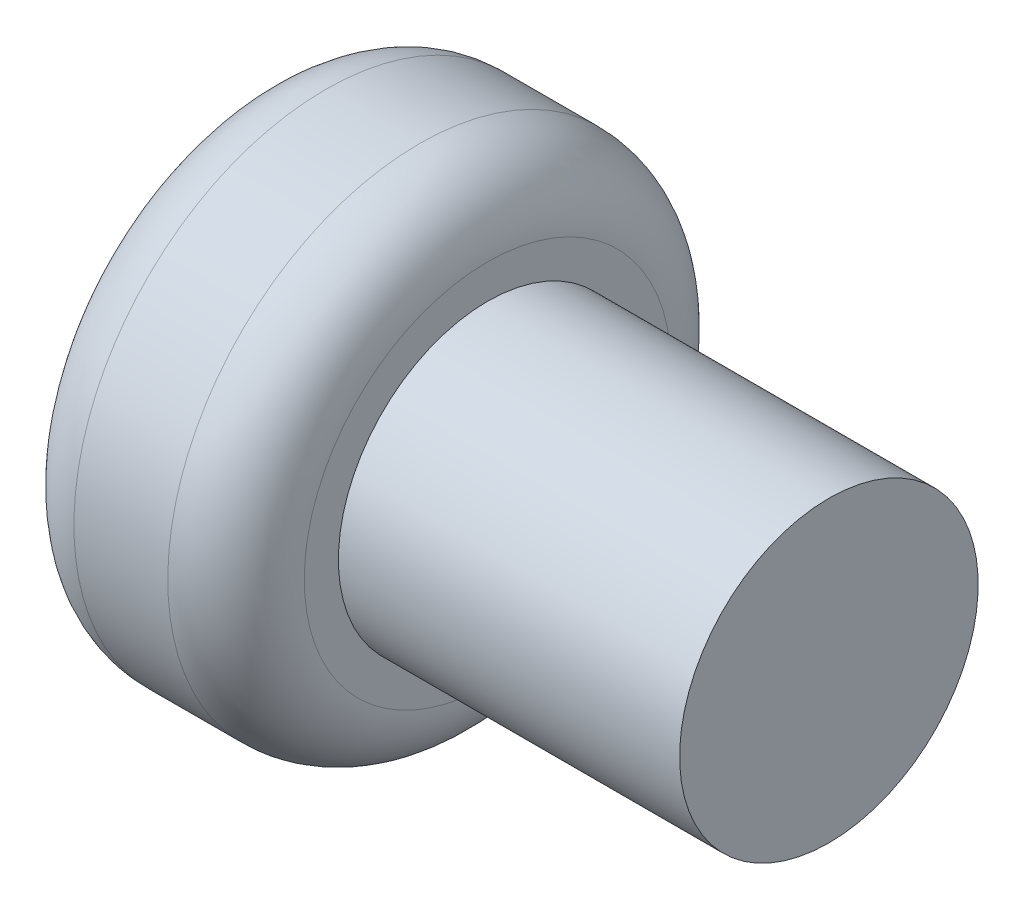
ISO-10303-21;
HEADER;
FILE_DESCRIPTION(('STEP AP214'),'2;1');
FILE_NAME('part.step','',(''),(''),'','','');
FILE_SCHEMA(('AUTOMOTIVE_DESIGN { 1 0 10303 214 1 1 1 1 }'));
ENDSEC;
DATA;
#1=APPLICATION_CONTEXT('core data for automotive mechanical design processes');
#2=APPLICATION_PROTOCOL_DEFINITION('international standard','automotive_design',2000,#1);
#3=PRODUCT_CONTEXT('',#1,'mechanical');
#4=PRODUCT('Part','Part','',(#3));
#5=PRODUCT_RELATED_PRODUCT_CATEGORY('part','',(#4));
#6=PRODUCT_DEFINITION_FORMATION('','',#4);
#7=PRODUCT_DEFINITION_CONTEXT('part definition',#1,'design');
#8=PRODUCT_DEFINITION('design','',#6,#7);
#9=PRODUCT_DEFINITION_SHAPE('','',#8);
#10=(LENGTH_UNIT() NAMED_UNIT(*) SI_UNIT(.MILLI.,.METRE.));
#11=(NAMED_UNIT(*) PLANE_ANGLE_UNIT() SI_UNIT($,.RADIAN.));
#12=(NAMED_UNIT(*) SI_UNIT($,.STERADIAN.) SOLID_ANGLE_UNIT());
#13=UNCERTAINTY_MEASURE_WITH_UNIT(LENGTH_MEASURE(1.E-05),#10,'distance_accuracy_value','');
#14=(GEOMETRIC_REPRESENTATION_CONTEXT(3) GLOBAL_UNCERTAINTY_ASSIGNED_CONTEXT((#13)) GLOBAL_UNIT_ASSIGNED_CONTEXT((#10,
#11,#12)) REPRESENTATION_CONTEXT('',''));
#15=CARTESIAN_POINT('',(0.,0.,0.));
#16=DIRECTION('',(0.,0.,1.));
#17=DIRECTION('',(1.,0.,0.));
#18=AXIS2_PLACEMENT_3D('',#15,#16,#17);
#19=CARTESIAN_POINT('',(0.,0.,0.));
#20=DIRECTION('',(-1.,0.,0.));
#21=DIRECTION('',(0.,-1.,0.));
#22=AXIS2_PLACEMENT_3D('',#19,#20,#21);
#23=PLANE('',#22);
#24=CARTESIAN_POINT('',(0.,0.,0.));
#25=DIRECTION('',(-1.,0.,0.));
#26=DIRECTION('',(0.,-1.,0.));
#27=AXIS2_PLACEMENT_3D('',#24,#25,#26);
#28=CIRCLE('',#27,2.15);
#29=CARTESIAN_POINT('',(0.,-2.15,0.));
#30=VERTEX_POINT('',#29);
#31=EDGE_CURVE('E11',#30,#30,#28,.T.);
#32=ORIENTED_EDGE('',*,*,#31,.T.);
#33=EDGE_LOOP('',(#32));
#34=FACE_BOUND('',#33,.T.);
#35=DIRECTION('',(0.,1.,0.));
#36=VECTOR('',#35,1.);
#37=CARTESIAN_POINT('',(0.,0.,0.3));
#38=LINE('',#37,#36);
#39=CARTESIAN_POINT('',(0.,0.3,0.3));
#40=VERTEX_POINT('',#39);
#41=CARTESIAN_POINT('',(0.,2.,0.3));
#42=VERTEX_POINT('',#41);
#43=EDGE_CURVE('E162',#40,#42,#38,.T.);
#44=ORIENTED_EDGE('',*,*,#43,.F.);
#45=DIRECTION('',(0.,0.,1.));
#46=VECTOR('',#45,1.);
#47=CARTESIAN_POINT('',(0.,0.3,0.));
#48=LINE('',#47,#46);
#49=CARTESIAN_POINT('',(0.,0.3,2.));
#50=VERTEX_POINT('',#49);
#51=EDGE_CURVE('E53',#40,#50,#48,.T.);
#52=ORIENTED_EDGE('',*,*,#51,.T.);
#53=DIRECTION('',(0.,1.,0.));
#54=VECTOR('',#53,1.);
#55=CARTESIAN_POINT('',(0.,0.,2.));
#56=LINE('',#55,#54);
#57=CARTESIAN_POINT('',(0.,-0.3,2.));
#58=VERTEX_POINT('',#57);
#59=EDGE_CURVE('E189',#58,#50,#56,.T.);
#60=ORIENTED_EDGE('',*,*,#59,.F.);
#61=DIRECTION('',(0.,0.,1.));
#62=VECTOR('',#61,1.);
#63=CARTESIAN_POINT('',(0.,-0.3,0.));
#64=LINE('',#63,#62);
#65=CARTESIAN_POINT('',(0.,-0.3,0.3));
#66=VERTEX_POINT('',#65);
#67=EDGE_CURVE('E187',#66,#58,#64,.T.);
#68=ORIENTED_EDGE('',*,*,#67,.F.);
#69=DIRECTION('',(0.,1.,0.));
#70=VECTOR('',#69,1.);
#71=CARTESIAN_POINT('',(0.,0.,0.3));
#72=LINE('',#71,#70);
#73=CARTESIAN_POINT('',(0.,-2.,0.3));
#74=VERTEX_POINT('',#73);
#75=EDGE_CURVE('E136',#74,#66,#72,.T.);
#76=ORIENTED_EDGE('',*,*,#75,.F.);
#77=DIRECTION('',(0.,0.,1.));
#78=VECTOR('',#77,1.);
#79=CARTESIAN_POINT('',(0.,-2.,0.));
#80=LINE('',#79,#78);
#81=CARTESIAN_POINT('',(0.,-2.,-0.3));
#82=VERTEX_POINT('',#81);
#83=EDGE_CURVE('E183',#82,#74,#80,.T.);
#84=ORIENTED_EDGE('',*,*,#83,.F.);
#85=DIRECTION('',(0.,1.,0.));
#86=VECTOR('',#85,1.);
#87=CARTESIAN_POINT('',(0.,0.,-0.3));
#88=LINE('',#87,#86);
#89=CARTESIAN_POINT('',(0.,-0.3,-0.3));
#90=VERTEX_POINT('',#89);
#91=EDGE_CURVE('E180',#82,#90,#88,.T.);
#92=ORIENTED_EDGE('',*,*,#91,.T.);
#93=DIRECTION('',(0.,0.,1.));
#94=VECTOR('',#93,1.);
#95=CARTESIAN_POINT('',(0.,-0.3,0.));
#96=LINE('',#95,#94);
#97=CARTESIAN_POINT('',(0.,-0.3,-2.));
#98=VERTEX_POINT('',#97);
#99=EDGE_CURVE('E177',#98,#90,#96,.T.);
#100=ORIENTED_EDGE('',*,*,#99,.F.);
#101=DIRECTION('',(0.,1.,0.));
#102=VECTOR('',#101,1.);
#103=CARTESIAN_POINT('',(0.,0.,-2.));
#104=LINE('',#103,#102);
#105=CARTESIAN_POINT('',(0.,0.3,-2.));
#106=VERTEX_POINT('',#105);
#107=EDGE_CURVE('E174',#98,#106,#104,.T.);
#108=ORIENTED_EDGE('',*,*,#107,.T.);
#109=DIRECTION('',(0.,0.,1.));
#110=VECTOR('',#109,1.);
#111=CARTESIAN_POINT('',(0.,0.3,0.));
#112=LINE('',#111,#110);
#113=CARTESIAN_POINT('',(0.,0.3,-0.3));
#114=VERTEX_POINT('',#113);
#115=EDGE_CURVE('E171',#106,#114,#112,.T.);
#116=ORIENTED_EDGE('',*,*,#115,.T.);
#117=DIRECTION('',(0.,1.,0.));
#118=VECTOR('',#117,1.);
#119=CARTESIAN_POINT('',(0.,0.,-0.3));
#120=LINE('',#119,#118);
#121=CARTESIAN_POINT('',(0.,2.,-0.3));
#122=VERTEX_POINT('',#121);
#123=EDGE_CURVE('E168',#114,#122,#120,.T.);
#124=ORIENTED_EDGE('',*,*,#123,.T.);
#125=DIRECTION('',(0.,0.,1.));
#126=VECTOR('',#125,1.);
#127=CARTESIAN_POINT('',(0.,2.,0.));
#128=LINE('',#127,#126);
#129=EDGE_CURVE('E165',#122,#42,#128,.T.);
#130=ORIENTED_EDGE('',*,*,#129,.T.);
#131=EDGE_LOOP('',(#44,#52,#60,#68,#76,#84,#92,#100,#108,#116,#124,#130));
#132=FACE_BOUND('',#131,.T.);
#133=ADVANCED_FACE('F38',(#34,#132),#23,.T.);
#134=CARTESIAN_POINT('',(6.7,0.,0.));
#135=DIRECTION('',(1.,0.,0.));
#136=DIRECTION('',(0.,1.,0.));
#137=AXIS2_PLACEMENT_3D('',#134,#135,#136);
#138=CYLINDRICAL_SURFACE('',#137,2.95);
#139=CARTESIAN_POINT('',(1.9,0.,0.));
#140=DIRECTION('',(1.,0.,0.));
#141=DIRECTION('',(0.,1.,0.));
#142=AXIS2_PLACEMENT_3D('',#139,#140,#141);
#143=CIRCLE('',#142,2.95);
#144=CARTESIAN_POINT('',(1.9,2.95,0.));
#145=VERTEX_POINT('',#144);
#146=EDGE_CURVE('E46',#145,#145,#143,.F.);
#147=ORIENTED_EDGE('',*,*,#146,.T.);
#148=EDGE_LOOP('',(#147));
#149=FACE_BOUND('',#148,.T.);
#150=CARTESIAN_POINT('',(0.8,0.,0.));
#151=DIRECTION('',(-1.,0.,0.));
#152=DIRECTION('',(0.,-1.,0.));
#153=AXIS2_PLACEMENT_3D('',#150,#151,#152);
#154=CIRCLE('',#153,2.95);
#155=CARTESIAN_POINT('',(0.8,-2.95,0.));
#156=VERTEX_POINT('',#155);
#157=EDGE_CURVE('E218',#156,#156,#154,.F.);
#158=ORIENTED_EDGE('',*,*,#157,.T.);
#159=EDGE_LOOP('',(#158));
#160=FACE_BOUND('',#159,.T.);
#161=ADVANCED_FACE('F223',(#149,#160),#138,.T.);
#162=CARTESIAN_POINT('',(2.7,2.95,0.));
#163=DIRECTION('',(1.,0.,0.));
#164=DIRECTION('',(0.,1.,0.));
#165=AXIS2_PLACEMENT_3D('',#162,#163,#164);
#166=PLANE('',#165);
#167=CARTESIAN_POINT('',(2.7,0.,0.));
#168=DIRECTION('',(1.,0.,0.));
#169=DIRECTION('',(0.,1.,0.));
#170=AXIS2_PLACEMENT_3D('',#167,#168,#169);
#171=CIRCLE('',#170,2.15);
#172=CARTESIAN_POINT('',(2.7,2.15,0.));
#173=VERTEX_POINT('',#172);
#174=EDGE_CURVE('E215',#173,#173,#171,.T.);
#175=ORIENTED_EDGE('',*,*,#174,.T.);
#176=EDGE_LOOP('',(#175));
#177=FACE_BOUND('',#176,.T.);
#178=CARTESIAN_POINT('',(2.7,0.,0.));
#179=DIRECTION('',(1.,0.,0.));
#180=DIRECTION('',(0.,1.,0.));
#181=AXIS2_PLACEMENT_3D('',#178,#179,#180);
#182=CIRCLE('',#181,1.75);
#183=CARTESIAN_POINT('',(2.7,1.75,0.));
#184=VERTEX_POINT('',#183);
#185=EDGE_CURVE('E212',#184,#184,#182,.T.);
#186=ORIENTED_EDGE('',*,*,#185,.F.);
#187=EDGE_LOOP('',(#186));
#188=FACE_BOUND('',#187,.T.);
#189=ADVANCED_FACE('F231',(#177,#188),#166,.T.);
#190=CARTESIAN_POINT('',(6.7,0.,0.));
#191=DIRECTION('',(1.,0.,0.));
#192=DIRECTION('',(0.,1.,0.));
#193=AXIS2_PLACEMENT_3D('',#190,#191,#192);
#194=CYLINDRICAL_SURFACE('',#193,1.75);
#195=ORIENTED_EDGE('',*,*,#185,.T.);
#196=EDGE_LOOP('',(#195));
#197=FACE_BOUND('',#196,.T.);
#198=CARTESIAN_POINT('',(6.7,0.,0.));
#199=DIRECTION('',(1.,0.,0.));
#200=DIRECTION('',(0.,1.,0.));
#201=AXIS2_PLACEMENT_3D('',#198,#199,#200);
#202=CIRCLE('',#201,1.75);
#203=CARTESIAN_POINT('',(6.7,1.75,0.));
#204=VERTEX_POINT('',#203);
#205=EDGE_CURVE('E192',#204,#204,#202,.T.);
#206=ORIENTED_EDGE('',*,*,#205,.F.);
#207=EDGE_LOOP('',(#206));
#208=FACE_BOUND('',#207,.T.);
#209=ADVANCED_FACE('F234',(#197,#208),#194,.T.);
#210=CARTESIAN_POINT('',(6.7,1.75,0.));
#211=DIRECTION('',(1.,0.,0.));
#212=DIRECTION('',(0.,1.,0.));
#213=AXIS2_PLACEMENT_3D('',#210,#211,#212);
#214=PLANE('',#213);
#215=ORIENTED_EDGE('',*,*,#205,.T.);
#216=EDGE_LOOP('',(#215));
#217=FACE_BOUND('',#216,.T.);
#218=ADVANCED_FACE('F240',(#217),#214,.T.);
#219=CARTESIAN_POINT('',(0.5,0.3,0.));
#220=DIRECTION('',(0.,-1.,0.));
#221=DIRECTION('',(1.,0.,0.));
#222=AXIS2_PLACEMENT_3D('',#219,#220,#221);
#223=PLANE('',#222);
#224=ORIENTED_EDGE('',*,*,#51,.F.);
#225=DIRECTION('',(-1.,0.,0.));
#226=VECTOR('',#225,1.);
#227=CARTESIAN_POINT('',(0.5,0.3,0.3));
#228=LINE('',#227,#226);
#229=CARTESIAN_POINT('',(0.5,0.3,0.3));
#230=VERTEX_POINT('',#229);
#231=EDGE_CURVE('E101',#230,#40,#228,.T.);
#232=ORIENTED_EDGE('',*,*,#231,.F.);
#233=DIRECTION('',(0.,0.,1.));
#234=VECTOR('',#233,1.);
#235=CARTESIAN_POINT('',(0.5,0.3,0.));
#236=LINE('',#235,#234);
#237=CARTESIAN_POINT('',(0.5,0.3,2.));
#238=VERTEX_POINT('',#237);
#239=EDGE_CURVE('E59',#230,#238,#236,.T.);
#240=ORIENTED_EDGE('',*,*,#239,.T.);
#241=DIRECTION('',(-1.,0.,0.));
#242=VECTOR('',#241,1.);
#243=CARTESIAN_POINT('',(0.5,0.3,2.));
#244=LINE('',#243,#242);
#245=EDGE_CURVE('E97',#238,#50,#244,.T.);
#246=ORIENTED_EDGE('',*,*,#245,.T.);
#247=EDGE_LOOP('',(#224,#232,#240,#246));
#248=FACE_BOUND('',#247,.T.);
#249=ADVANCED_FACE('F245',(#248),#223,.T.);
#250=CARTESIAN_POINT('',(0.5,0.,2.));
#251=DIRECTION('',(0.,0.,1.));
#252=DIRECTION('',(1.,0.,0.));
#253=AXIS2_PLACEMENT_3D('',#250,#251,#252);
#254=PLANE('',#253);
#255=ORIENTED_EDGE('',*,*,#59,.T.);
#256=ORIENTED_EDGE('',*,*,#245,.F.);
#257=DIRECTION('',(0.,1.,0.));
#258=VECTOR('',#257,1.);
#259=CARTESIAN_POINT('',(0.5,0.,2.));
#260=LINE('',#259,#258);
#261=CARTESIAN_POINT('',(0.5,-0.3,2.));
#262=VERTEX_POINT('',#261);
#263=EDGE_CURVE('E149',#262,#238,#260,.T.);
#264=ORIENTED_EDGE('',*,*,#263,.F.);
#265=DIRECTION('',(-1.,0.,0.));
#266=VECTOR('',#265,1.);
#267=CARTESIAN_POINT('',(0.5,-0.3,2.));
#268=LINE('',#267,#266);
#269=EDGE_CURVE('E140',#262,#58,#268,.T.);
#270=ORIENTED_EDGE('',*,*,#269,.T.);
#271=EDGE_LOOP('',(#255,#256,#264,#270));
#272=FACE_BOUND('',#271,.T.);
#273=ADVANCED_FACE('F250',(#272),#254,.F.);
#274=CARTESIAN_POINT('',(0.5,-0.3,0.));
#275=DIRECTION('',(0.,-1.,0.));
#276=DIRECTION('',(1.,0.,0.));
#277=AXIS2_PLACEMENT_3D('',#274,#275,#276);
#278=PLANE('',#277);
#279=ORIENTED_EDGE('',*,*,#67,.T.);
#280=ORIENTED_EDGE('',*,*,#269,.F.);
#281=DIRECTION('',(0.,0.,1.));
#282=VECTOR('',#281,1.);
#283=CARTESIAN_POINT('',(0.5,-0.3,0.));
#284=LINE('',#283,#282);
#285=CARTESIAN_POINT('',(0.5,-0.3,0.3));
#286=VERTEX_POINT('',#285);
#287=EDGE_CURVE('E144',#286,#262,#284,.T.);
#288=ORIENTED_EDGE('',*,*,#287,.F.);
#289=DIRECTION('',(-1.,0.,0.));
#290=VECTOR('',#289,1.);
#291=CARTESIAN_POINT('',(0.5,-0.3,0.3));
#292=LINE('',#291,#290);
#293=EDGE_CURVE('E129',#286,#66,#292,.T.);
#294=ORIENTED_EDGE('',*,*,#293,.T.);
#295=EDGE_LOOP('',(#279,#280,#288,#294));
#296=FACE_BOUND('',#295,.T.);
#297=ADVANCED_FACE('F145',(#296),#278,.F.);
#298=CARTESIAN_POINT('',(0.5,0.,0.3));
#299=DIRECTION('',(0.,0.,1.));
#300=DIRECTION('',(0.,-1.,0.));
#301=AXIS2_PLACEMENT_3D('',#298,#299,#300);
#302=PLANE('',#301);
#303=ORIENTED_EDGE('',*,*,#75,.T.);
#304=ORIENTED_EDGE('',*,*,#293,.F.);
#305=DIRECTION('',(0.,1.,0.));
#306=VECTOR('',#305,1.);
#307=CARTESIAN_POINT('',(0.5,0.,0.3));
#308=LINE('',#307,#306);
#309=CARTESIAN_POINT('',(0.5,-2.,0.3));
#310=VERTEX_POINT('',#309);
#311=EDGE_CURVE('E133',#310,#286,#308,.T.);
#312=ORIENTED_EDGE('',*,*,#311,.F.);
#313=DIRECTION('',(-1.,0.,0.));
#314=VECTOR('',#313,1.);
#315=CARTESIAN_POINT('',(0.5,-2.,0.3));
#316=LINE('',#315,#314);
#317=EDGE_CURVE('E141',#310,#74,#316,.T.);
#318=ORIENTED_EDGE('',*,*,#317,.T.);
#319=EDGE_LOOP('',(#303,#304,#312,#318));
#320=FACE_BOUND('',#319,.T.);
#321=ADVANCED_FACE('F131',(#320),#302,.F.);
#322=CARTESIAN_POINT('',(0.5,-2.,0.));
#323=DIRECTION('',(0.,-1.,0.));
#324=DIRECTION('',(1.,0.,0.));
#325=AXIS2_PLACEMENT_3D('',#322,#323,#324);
#326=PLANE('',#325);
#327=ORIENTED_EDGE('',*,*,#83,.T.);
#328=ORIENTED_EDGE('',*,*,#317,.F.);
#329=DIRECTION('',(0.,0.,1.));
#330=VECTOR('',#329,1.);
#331=CARTESIAN_POINT('',(0.5,-2.,0.));
#332=LINE('',#331,#330);
#333=CARTESIAN_POINT('',(0.5,-2.,-0.3));
#334=VERTEX_POINT('',#333);
#335=EDGE_CURVE('E154',#334,#310,#332,.T.);
#336=ORIENTED_EDGE('',*,*,#335,.F.);
#337=DIRECTION('',(-1.,0.,0.));
#338=VECTOR('',#337,1.);
#339=CARTESIAN_POINT('',(0.5,-2.,-0.3));
#340=LINE('',#339,#338);
#341=EDGE_CURVE('E195',#334,#82,#340,.T.);
#342=ORIENTED_EDGE('',*,*,#341,.T.);
#343=EDGE_LOOP('',(#327,#328,#336,#342));
#344=FACE_BOUND('',#343,.T.);
#345=ADVANCED_FACE('F306',(#344),#326,.F.);
#346=CARTESIAN_POINT('',(0.5,0.,-0.3));
#347=DIRECTION('',(0.,0.,1.));
#348=DIRECTION('',(0.,-1.,0.));
#349=AXIS2_PLACEMENT_3D('',#346,#347,#348);
#350=PLANE('',#349);
#351=ORIENTED_EDGE('',*,*,#91,.F.);
#352=ORIENTED_EDGE('',*,*,#341,.F.);
#353=DIRECTION('',(0.,1.,0.));
#354=VECTOR('',#353,1.);
#355=CARTESIAN_POINT('',(0.5,0.,-0.3));
#356=LINE('',#355,#354);
#357=CARTESIAN_POINT('',(0.5,-0.3,-0.3));
#358=VERTEX_POINT('',#357);
#359=EDGE_CURVE('E156',#334,#358,#356,.T.);
#360=ORIENTED_EDGE('',*,*,#359,.T.);
#361=DIRECTION('',(-1.,0.,0.));
#362=VECTOR('',#361,1.);
#363=CARTESIAN_POINT('',(0.5,-0.3,-0.3));
#364=LINE('',#363,#362);
#365=EDGE_CURVE('E197',#358,#90,#364,.T.);
#366=ORIENTED_EDGE('',*,*,#365,.T.);
#367=EDGE_LOOP('',(#351,#352,#360,#366));
#368=FACE_BOUND('',#367,.T.);
#369=ADVANCED_FACE('F287',(#368),#350,.T.);
#370=CARTESIAN_POINT('',(0.5,-0.3,0.));
#371=DIRECTION('',(0.,-1.,0.));
#372=DIRECTION('',(1.,0.,0.));
#373=AXIS2_PLACEMENT_3D('',#370,#371,#372);
#374=PLANE('',#373);
#375=ORIENTED_EDGE('',*,*,#99,.T.);
#376=ORIENTED_EDGE('',*,*,#365,.F.);
#377=DIRECTION('',(0.,0.,1.));
#378=VECTOR('',#377,1.);
#379=CARTESIAN_POINT('',(0.5,-0.3,0.));
#380=LINE('',#379,#378);
#381=CARTESIAN_POINT('',(0.5,-0.3,-2.));
#382=VERTEX_POINT('',#381);
#383=EDGE_CURVE('E282',#382,#358,#380,.T.);
#384=ORIENTED_EDGE('',*,*,#383,.F.);
#385=DIRECTION('',(-1.,0.,0.));
#386=VECTOR('',#385,1.);
#387=CARTESIAN_POINT('',(0.5,-0.3,-2.));
#388=LINE('',#387,#386);
#389=EDGE_CURVE('E199',#382,#98,#388,.T.);
#390=ORIENTED_EDGE('',*,*,#389,.T.);
#391=EDGE_LOOP('',(#375,#376,#384,#390));
#392=FACE_BOUND('',#391,.T.);
#393=ADVANCED_FACE('F290',(#392),#374,.F.);
#394=CARTESIAN_POINT('',(0.5,0.,-2.));
#395=DIRECTION('',(0.,0.,1.));
#396=DIRECTION('',(1.,0.,0.));
#397=AXIS2_PLACEMENT_3D('',#394,#395,#396);
#398=PLANE('',#397);
#399=ORIENTED_EDGE('',*,*,#107,.F.);
#400=ORIENTED_EDGE('',*,*,#389,.F.);
#401=DIRECTION('',(0.,1.,0.));
#402=VECTOR('',#401,1.);
#403=CARTESIAN_POINT('',(0.5,0.,-2.));
#404=LINE('',#403,#402);
#405=CARTESIAN_POINT('',(0.5,0.3,-2.));
#406=VERTEX_POINT('',#405);
#407=EDGE_CURVE('E280',#382,#406,#404,.T.);
#408=ORIENTED_EDGE('',*,*,#407,.T.);
#409=DIRECTION('',(-1.,0.,0.));
#410=VECTOR('',#409,1.);
#411=CARTESIAN_POINT('',(0.5,0.3,-2.));
#412=LINE('',#411,#410);
#413=EDGE_CURVE('E201',#406,#106,#412,.T.);
#414=ORIENTED_EDGE('',*,*,#413,.T.);
#415=EDGE_LOOP('',(#399,#400,#408,#414));
#416=FACE_BOUND('',#415,.T.);
#417=ADVANCED_FACE('F298',(#416),#398,.T.);
#418=CARTESIAN_POINT('',(0.5,0.3,0.));
#419=DIRECTION('',(0.,-1.,0.));
#420=DIRECTION('',(1.,0.,0.));
#421=AXIS2_PLACEMENT_3D('',#418,#419,#420);
#422=PLANE('',#421);
#423=ORIENTED_EDGE('',*,*,#115,.F.);
#424=ORIENTED_EDGE('',*,*,#413,.F.);
#425=DIRECTION('',(0.,0.,1.));
#426=VECTOR('',#425,1.);
#427=CARTESIAN_POINT('',(0.5,0.3,0.));
#428=LINE('',#427,#426);
#429=CARTESIAN_POINT('',(0.5,0.3,-0.3));
#430=VERTEX_POINT('',#429);
#431=EDGE_CURVE('E278',#406,#430,#428,.T.);
#432=ORIENTED_EDGE('',*,*,#431,.T.);
#433=DIRECTION('',(-1.,0.,0.));
#434=VECTOR('',#433,1.);
#435=CARTESIAN_POINT('',(0.5,0.3,-0.3));
#436=LINE('',#435,#434);
#437=EDGE_CURVE('E203',#430,#114,#436,.T.);
#438=ORIENTED_EDGE('',*,*,#437,.T.);
#439=EDGE_LOOP('',(#423,#424,#432,#438));
#440=FACE_BOUND('',#439,.T.);
#441=ADVANCED_FACE('F301',(#440),#422,.T.);
#442=CARTESIAN_POINT('',(0.5,0.,-0.3));
#443=DIRECTION('',(0.,0.,1.));
#444=DIRECTION('',(0.,-1.,0.));
#445=AXIS2_PLACEMENT_3D('',#442,#443,#444);
#446=PLANE('',#445);
#447=ORIENTED_EDGE('',*,*,#123,.F.);
#448=ORIENTED_EDGE('',*,*,#437,.F.);
#449=DIRECTION('',(0.,1.,0.));
#450=VECTOR('',#449,1.);
#451=CARTESIAN_POINT('',(0.5,0.,-0.3));
#452=LINE('',#451,#450);
#453=CARTESIAN_POINT('',(0.5,2.,-0.3));
#454=VERTEX_POINT('',#453);
#455=EDGE_CURVE('E273',#430,#454,#452,.T.);
#456=ORIENTED_EDGE('',*,*,#455,.T.);
#457=DIRECTION('',(-1.,0.,0.));
#458=VECTOR('',#457,1.);
#459=CARTESIAN_POINT('',(0.5,2.,-0.3));
#460=LINE('',#459,#458);
#461=EDGE_CURVE('E205',#454,#122,#460,.T.);
#462=ORIENTED_EDGE('',*,*,#461,.T.);
#463=EDGE_LOOP('',(#447,#448,#456,#462));
#464=FACE_BOUND('',#463,.T.);
#465=ADVANCED_FACE('F323',(#464),#446,.T.);
#466=CARTESIAN_POINT('',(0.5,2.,0.));
#467=DIRECTION('',(0.,-1.,0.));
#468=DIRECTION('',(1.,0.,0.));
#469=AXIS2_PLACEMENT_3D('',#466,#467,#468);
#470=PLANE('',#469);
#471=ORIENTED_EDGE('',*,*,#129,.F.);
#472=ORIENTED_EDGE('',*,*,#461,.F.);
#473=DIRECTION('',(0.,0.,1.));
#474=VECTOR('',#473,1.);
#475=CARTESIAN_POINT('',(0.5,2.,0.));
#476=LINE('',#475,#474);
#477=CARTESIAN_POINT('',(0.5,2.,0.3));
#478=VERTEX_POINT('',#477);
#479=EDGE_CURVE('E271',#454,#478,#476,.T.);
#480=ORIENTED_EDGE('',*,*,#479,.T.);
#481=DIRECTION('',(-1.,0.,0.));
#482=VECTOR('',#481,1.);
#483=CARTESIAN_POINT('',(0.5,2.,0.3));
#484=LINE('',#483,#482);
#485=EDGE_CURVE('E207',#478,#42,#484,.T.);
#486=ORIENTED_EDGE('',*,*,#485,.T.);
#487=EDGE_LOOP('',(#471,#472,#480,#486));
#488=FACE_BOUND('',#487,.T.);
#489=ADVANCED_FACE('F326',(#488),#470,.T.);
#490=CARTESIAN_POINT('',(0.5,0.,0.3));
#491=DIRECTION('',(0.,0.,1.));
#492=DIRECTION('',(0.,-1.,0.));
#493=AXIS2_PLACEMENT_3D('',#490,#491,#492);
#494=PLANE('',#493);
#495=ORIENTED_EDGE('',*,*,#43,.T.);
#496=ORIENTED_EDGE('',*,*,#485,.F.);
#497=DIRECTION('',(0.,1.,0.));
#498=VECTOR('',#497,1.);
#499=CARTESIAN_POINT('',(0.5,0.,0.3));
#500=LINE('',#499,#498);
#501=EDGE_CURVE('E269',#230,#478,#500,.T.);
#502=ORIENTED_EDGE('',*,*,#501,.F.);
#503=ORIENTED_EDGE('',*,*,#231,.T.);
#504=EDGE_LOOP('',(#495,#496,#502,#503));
#505=FACE_BOUND('',#504,.T.);
#506=ADVANCED_FACE('F266',(#505),#494,.F.);
#507=CARTESIAN_POINT('',(0.5,0.,0.));
#508=DIRECTION('',(-1.,0.,0.));
#509=DIRECTION('',(0.,-1.,0.));
#510=AXIS2_PLACEMENT_3D('',#507,#508,#509);
#511=PLANE('',#510);
#512=ORIENTED_EDGE('',*,*,#239,.F.);
#513=ORIENTED_EDGE('',*,*,#501,.T.);
#514=ORIENTED_EDGE('',*,*,#479,.F.);
#515=ORIENTED_EDGE('',*,*,#455,.F.);
#516=ORIENTED_EDGE('',*,*,#431,.F.);
#517=ORIENTED_EDGE('',*,*,#407,.F.);
#518=ORIENTED_EDGE('',*,*,#383,.T.);
#519=ORIENTED_EDGE('',*,*,#359,.F.);
#520=ORIENTED_EDGE('',*,*,#335,.T.);
#521=ORIENTED_EDGE('',*,*,#311,.T.);
#522=ORIENTED_EDGE('',*,*,#287,.T.);
#523=ORIENTED_EDGE('',*,*,#263,.T.);
#524=EDGE_LOOP('',(#512,#513,#514,#515,#516,#517,#518,#519,#520,#521,#522,#523));
#525=FACE_BOUND('',#524,.T.);
#526=ADVANCED_FACE('F151',(#525),#511,.T.);
#527=CARTESIAN_POINT('',(1.9,0.,0.));
#528=DIRECTION('',(1.,0.,0.));
#529=DIRECTION('',(0.,1.,0.));
#530=AXIS2_PLACEMENT_3D('',#527,#528,#529);
#531=TOROIDAL_SURFACE('',#530,2.15,0.8);
#532=ORIENTED_EDGE('',*,*,#146,.F.);
#533=EDGE_LOOP('',(#532));
#534=FACE_BOUND('',#533,.T.);
#535=ORIENTED_EDGE('',*,*,#174,.F.);
#536=EDGE_LOOP('',(#535));
#537=FACE_BOUND('',#536,.T.);
#538=ADVANCED_FACE('F226',(#534,#537),#531,.T.);
#539=CARTESIAN_POINT('',(0.8,0.,0.));
#540=DIRECTION('',(-1.,0.,0.));
#541=DIRECTION('',(0.,-1.,0.));
#542=AXIS2_PLACEMENT_3D('',#539,#540,#541);
#543=TOROIDAL_SURFACE('',#542,2.15,0.8);
#544=ORIENTED_EDGE('',*,*,#31,.F.);
#545=EDGE_LOOP('',(#544));
#546=FACE_BOUND('',#545,.T.);
#547=ORIENTED_EDGE('',*,*,#157,.F.);
#548=EDGE_LOOP('',(#547));
#549=FACE_BOUND('',#548,.T.);
#550=ADVANCED_FACE('F40',(#546,#549),#543,.T.);
#551=CLOSED_SHELL('',(#133,#161,#189,#209,#218,#249,#273,#297,#321,#345,#369,#393,#417,#441,
#465,#489,#506,#526,#538,#550));
#552=MANIFOLD_SOLID_BREP('B2',#551);
#553=ADVANCED_BREP_SHAPE_REPRESENTATION('',(#18,#552),#14);
#554=SHAPE_DEFINITION_REPRESENTATION(#9,#553);
ENDSEC;
END-ISO-10303-21;
